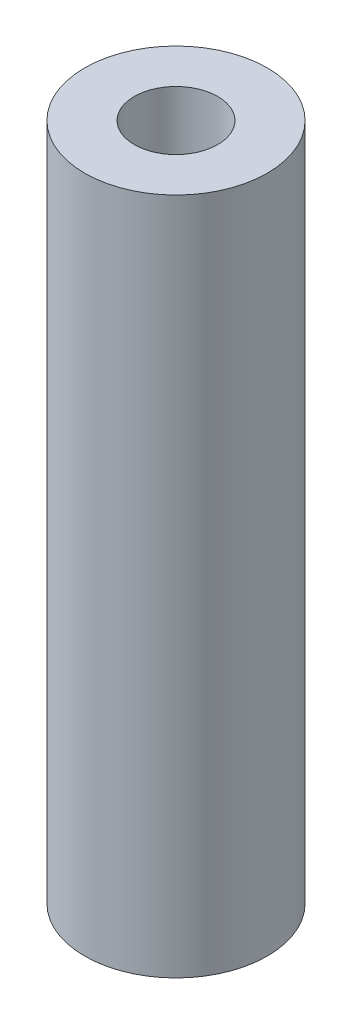
ISO-10303-21;
HEADER;
FILE_DESCRIPTION(('STEP AP214'),'2;1');
FILE_NAME('part.step','',(''),(''),'','','');
FILE_SCHEMA(('AUTOMOTIVE_DESIGN { 1 0 10303 214 1 1 1 1 }'));
ENDSEC;
DATA;
#1=APPLICATION_CONTEXT('core data for automotive mechanical design processes');
#2=APPLICATION_PROTOCOL_DEFINITION('international standard','automotive_design',2000,#1);
#3=PRODUCT_CONTEXT('',#1,'mechanical');
#4=PRODUCT('Part','Part','',(#3));
#5=PRODUCT_RELATED_PRODUCT_CATEGORY('part','',(#4));
#6=PRODUCT_DEFINITION_FORMATION('','',#4);
#7=PRODUCT_DEFINITION_CONTEXT('part definition',#1,'design');
#8=PRODUCT_DEFINITION('design','',#6,#7);
#9=PRODUCT_DEFINITION_SHAPE('','',#8);
#10=(LENGTH_UNIT() NAMED_UNIT(*) SI_UNIT(.MILLI.,.METRE.));
#11=(NAMED_UNIT(*) PLANE_ANGLE_UNIT() SI_UNIT($,.RADIAN.));
#12=(NAMED_UNIT(*) SI_UNIT($,.STERADIAN.) SOLID_ANGLE_UNIT());
#13=UNCERTAINTY_MEASURE_WITH_UNIT(LENGTH_MEASURE(1.E-05),#10,'distance_accuracy_value','');
#14=(GEOMETRIC_REPRESENTATION_CONTEXT(3) GLOBAL_UNCERTAINTY_ASSIGNED_CONTEXT((#13)) GLOBAL_UNIT_ASSIGNED_CONTEXT((#10,
#11,#12)) REPRESENTATION_CONTEXT('',''));
#15=CARTESIAN_POINT('',(0.,0.,0.));
#16=DIRECTION('',(0.,0.,1.));
#17=DIRECTION('',(1.,0.,0.));
#18=AXIS2_PLACEMENT_3D('',#15,#16,#17);
#19=CARTESIAN_POINT('',(0.,26.,0.));
#20=DIRECTION('',(0.,1.,0.));
#21=DIRECTION('',(0.,0.,1.));
#22=AXIS2_PLACEMENT_3D('',#19,#20,#21);
#23=PLANE('',#22);
#24=CARTESIAN_POINT('',(0.,26.,0.));
#25=DIRECTION('',(0.,1.,0.));
#26=DIRECTION('',(0.,0.,1.));
#27=AXIS2_PLACEMENT_3D('',#24,#25,#26);
#28=CIRCLE('',#27,3.5);
#29=CARTESIAN_POINT('',(0.,26.,-3.5));
#30=VERTEX_POINT('',#29);
#31=EDGE_CURVE('E10',#30,#30,#28,.T.);
#32=ORIENTED_EDGE('',*,*,#31,.T.);
#33=EDGE_LOOP('',(#32));
#34=FACE_BOUND('',#33,.T.);
#35=CARTESIAN_POINT('',(0.,26.,0.));
#36=DIRECTION('',(0.,1.,0.));
#37=DIRECTION('',(0.,0.,1.));
#38=AXIS2_PLACEMENT_3D('',#35,#36,#37);
#39=CIRCLE('',#38,1.6);
#40=CARTESIAN_POINT('',(0.,26.,-1.6));
#41=VERTEX_POINT('',#40);
#42=EDGE_CURVE('E46',#41,#41,#39,.T.);
#43=ORIENTED_EDGE('',*,*,#42,.F.);
#44=EDGE_LOOP('',(#43));
#45=FACE_BOUND('',#44,.T.);
#46=ADVANCED_FACE('F35',(#34,#45),#23,.T.);
#47=CARTESIAN_POINT('',(0.,0.,0.));
#48=DIRECTION('',(0.,1.,0.));
#49=DIRECTION('',(0.,0.,1.));
#50=AXIS2_PLACEMENT_3D('',#47,#48,#49);
#51=PLANE('',#50);
#52=CARTESIAN_POINT('',(0.,0.,0.));
#53=DIRECTION('',(0.,1.,0.));
#54=DIRECTION('',(0.,0.,1.));
#55=AXIS2_PLACEMENT_3D('',#52,#53,#54);
#56=CIRCLE('',#55,3.5);
#57=CARTESIAN_POINT('',(0.,0.,-3.5));
#58=VERTEX_POINT('',#57);
#59=EDGE_CURVE('E39',#58,#58,#56,.T.);
#60=ORIENTED_EDGE('',*,*,#59,.F.);
#61=EDGE_LOOP('',(#60));
#62=FACE_BOUND('',#61,.T.);
#63=CARTESIAN_POINT('',(0.,0.,0.));
#64=DIRECTION('',(0.,1.,0.));
#65=DIRECTION('',(0.,0.,1.));
#66=AXIS2_PLACEMENT_3D('',#63,#64,#65);
#67=CIRCLE('',#66,1.6);
#68=CARTESIAN_POINT('',(0.,0.,-1.6));
#69=VERTEX_POINT('',#68);
#70=EDGE_CURVE('E48',#69,#69,#67,.T.);
#71=ORIENTED_EDGE('',*,*,#70,.T.);
#72=EDGE_LOOP('',(#71));
#73=FACE_BOUND('',#72,.T.);
#74=ADVANCED_FACE('F58',(#62,#73),#51,.F.);
#75=CARTESIAN_POINT('',(0.,26.,0.));
#76=DIRECTION('',(0.,-1.,0.));
#77=DIRECTION('',(0.,0.,-1.));
#78=AXIS2_PLACEMENT_3D('',#75,#76,#77);
#79=CYLINDRICAL_SURFACE('',#78,3.5);
#80=CARTESIAN_POINT('',(0.,26.,-3.5));
#81=CARTESIAN_POINT('',(0.,25.7291666666667,-3.5));
#82=CARTESIAN_POINT('',(0.,25.4583333333333,-3.5));
#83=CARTESIAN_POINT('',(0.,24.9166666666667,-3.5));
#84=CARTESIAN_POINT('',(0.,24.6458333333333,-3.5));
#85=CARTESIAN_POINT('',(0.,24.1041666666667,-3.5));
#86=CARTESIAN_POINT('',(0.,23.8333333333333,-3.5));
#87=CARTESIAN_POINT('',(0.,23.2916666666667,-3.5));
#88=CARTESIAN_POINT('',(0.,23.0208333333333,-3.5));
#89=CARTESIAN_POINT('',(0.,22.4791666666667,-3.5));
#90=CARTESIAN_POINT('',(0.,22.2083333333333,-3.5));
#91=CARTESIAN_POINT('',(0.,21.6666666666667,-3.5));
#92=CARTESIAN_POINT('',(0.,21.3958333333333,-3.5));
#93=CARTESIAN_POINT('',(0.,20.8541666666667,-3.5));
#94=CARTESIAN_POINT('',(0.,20.5833333333333,-3.5));
#95=CARTESIAN_POINT('',(0.,20.0416666666667,-3.5));
#96=CARTESIAN_POINT('',(0.,19.7708333333333,-3.5));
#97=CARTESIAN_POINT('',(0.,19.2291666666667,-3.5));
#98=CARTESIAN_POINT('',(0.,18.9583333333333,-3.5));
#99=CARTESIAN_POINT('',(0.,18.4166666666667,-3.5));
#100=CARTESIAN_POINT('',(0.,18.1458333333333,-3.5));
#101=CARTESIAN_POINT('',(0.,17.6041666666667,-3.5));
#102=CARTESIAN_POINT('',(0.,17.3333333333333,-3.5));
#103=CARTESIAN_POINT('',(0.,16.7916666666667,-3.5));
#104=CARTESIAN_POINT('',(0.,16.5208333333333,-3.5));
#105=CARTESIAN_POINT('',(0.,15.9791666666667,-3.5));
#106=CARTESIAN_POINT('',(0.,15.7083333333333,-3.5));
#107=CARTESIAN_POINT('',(0.,15.1666666666667,-3.5));
#108=CARTESIAN_POINT('',(0.,14.8958333333333,-3.5));
#109=CARTESIAN_POINT('',(0.,14.3541666666667,-3.5));
#110=CARTESIAN_POINT('',(0.,14.0833333333333,-3.5));
#111=CARTESIAN_POINT('',(0.,13.5416666666667,-3.5));
#112=CARTESIAN_POINT('',(0.,13.2708333333333,-3.5));
#113=CARTESIAN_POINT('',(0.,12.7291666666667,-3.5));
#114=CARTESIAN_POINT('',(0.,12.4583333333333,-3.5));
#115=CARTESIAN_POINT('',(0.,11.9166666666667,-3.5));
#116=CARTESIAN_POINT('',(0.,11.6458333333333,-3.5));
#117=CARTESIAN_POINT('',(0.,11.1041666666667,-3.5));
#118=CARTESIAN_POINT('',(0.,10.8333333333333,-3.5));
#119=CARTESIAN_POINT('',(0.,10.2916666666667,-3.5));
#120=CARTESIAN_POINT('',(0.,10.0208333333333,-3.5));
#121=CARTESIAN_POINT('',(0.,9.47916666666667,-3.5));
#122=CARTESIAN_POINT('',(0.,9.20833333333333,-3.5));
#123=CARTESIAN_POINT('',(0.,8.66666666666667,-3.5));
#124=CARTESIAN_POINT('',(0.,8.39583333333333,-3.5));
#125=CARTESIAN_POINT('',(0.,7.85416666666667,-3.5));
#126=CARTESIAN_POINT('',(0.,7.58333333333333,-3.5));
#127=CARTESIAN_POINT('',(0.,7.04166666666667,-3.5));
#128=CARTESIAN_POINT('',(0.,6.77083333333333,-3.5));
#129=CARTESIAN_POINT('',(0.,6.22916666666667,-3.5));
#130=CARTESIAN_POINT('',(0.,5.95833333333333,-3.5));
#131=CARTESIAN_POINT('',(0.,5.41666666666667,-3.5));
#132=CARTESIAN_POINT('',(0.,5.14583333333333,-3.5));
#133=CARTESIAN_POINT('',(0.,4.60416666666667,-3.5));
#134=CARTESIAN_POINT('',(0.,4.33333333333333,-3.5));
#135=CARTESIAN_POINT('',(0.,3.79166666666667,-3.5));
#136=CARTESIAN_POINT('',(0.,3.52083333333333,-3.5));
#137=CARTESIAN_POINT('',(0.,2.97916666666667,-3.5));
#138=CARTESIAN_POINT('',(0.,2.70833333333333,-3.5));
#139=CARTESIAN_POINT('',(0.,2.16666666666667,-3.5));
#140=CARTESIAN_POINT('',(0.,1.89583333333333,-3.5));
#141=CARTESIAN_POINT('',(0.,1.35416666666667,-3.5));
#142=CARTESIAN_POINT('',(0.,1.08333333333333,-3.5));
#143=CARTESIAN_POINT('',(0.,0.541666666666667,-3.5));
#144=CARTESIAN_POINT('',(0.,0.270833333333334,-3.5));
#145=CARTESIAN_POINT('',(0.,0.,-3.5));
#146=B_SPLINE_CURVE_WITH_KNOTS('',3,(#80,#81,#82,#83,#84,#85,#86,#87,#88,#89,#90,#91,#92,#93,
#94,#95,#96,#97,#98,#99,#100,#101,#102,#103,#104,#105,#106,#107,#108,#109,#110,#111,#112,#113,
#114,#115,#116,#117,#118,#119,#120,#121,#122,#123,#124,#125,#126,#127,#128,#129,#130,#131,#132,
#133,#134,#135,#136,#137,#138,#139,#140,#141,#142,#143,#144,#145),.UNSPECIFIED.,.F.,.F.,(4,2,2,
2,2,2,2,2,2,2,2,2,2,2,2,2,2,2,2,2,2,2,2,2,2,2,2,2,2,2,2,2,4),(0.,0.812499999999997,1.625,2.4375,
3.25,4.0625,4.875,5.6875,6.5,7.3125,8.125,8.93749999999999,9.74999999999999,10.5625,11.375,
12.1875,13.,13.8125,14.625,15.4375,16.25,17.0625,17.875,18.6875,19.5,20.3125,21.125,21.9375,
22.75,23.5625,24.375,25.1875,26.),.UNSPECIFIED.);
#147=EDGE_CURVE('BSEAM37',#30,#58,#146,.T.);
#148=ORIENTED_EDGE('',*,*,#31,.F.);
#149=ORIENTED_EDGE('',*,*,#59,.T.);
#150=ORIENTED_EDGE('',*,*,#147,.T.);
#151=ORIENTED_EDGE('',*,*,#147,.F.);
#152=EDGE_LOOP('',(#148,#150,#149,#151));
#153=FACE_BOUND('',#152,.T.);
#154=ADVANCED_FACE('F37',(#153),#79,.T.);
#155=CARTESIAN_POINT('',(0.,26.,0.));
#156=DIRECTION('',(0.,-1.,0.));
#157=DIRECTION('',(0.,0.,-1.));
#158=AXIS2_PLACEMENT_3D('',#155,#156,#157);
#159=CYLINDRICAL_SURFACE('',#158,1.6);
#160=CARTESIAN_POINT('',(0.,26.,-1.6));
#161=CARTESIAN_POINT('',(0.,25.7291666666667,-1.6));
#162=CARTESIAN_POINT('',(0.,25.4583333333333,-1.6));
#163=CARTESIAN_POINT('',(0.,24.9166666666667,-1.6));
#164=CARTESIAN_POINT('',(0.,24.6458333333333,-1.6));
#165=CARTESIAN_POINT('',(0.,24.1041666666667,-1.6));
#166=CARTESIAN_POINT('',(0.,23.8333333333333,-1.6));
#167=CARTESIAN_POINT('',(0.,23.2916666666667,-1.6));
#168=CARTESIAN_POINT('',(0.,23.0208333333333,-1.6));
#169=CARTESIAN_POINT('',(0.,22.4791666666667,-1.6));
#170=CARTESIAN_POINT('',(0.,22.2083333333333,-1.6));
#171=CARTESIAN_POINT('',(0.,21.6666666666667,-1.6));
#172=CARTESIAN_POINT('',(0.,21.3958333333333,-1.6));
#173=CARTESIAN_POINT('',(0.,20.8541666666667,-1.6));
#174=CARTESIAN_POINT('',(0.,20.5833333333333,-1.6));
#175=CARTESIAN_POINT('',(0.,20.0416666666667,-1.6));
#176=CARTESIAN_POINT('',(0.,19.7708333333333,-1.6));
#177=CARTESIAN_POINT('',(0.,19.2291666666667,-1.6));
#178=CARTESIAN_POINT('',(0.,18.9583333333333,-1.6));
#179=CARTESIAN_POINT('',(0.,18.4166666666667,-1.6));
#180=CARTESIAN_POINT('',(0.,18.1458333333333,-1.6));
#181=CARTESIAN_POINT('',(0.,17.6041666666667,-1.6));
#182=CARTESIAN_POINT('',(0.,17.3333333333333,-1.6));
#183=CARTESIAN_POINT('',(0.,16.7916666666667,-1.6));
#184=CARTESIAN_POINT('',(0.,16.5208333333333,-1.6));
#185=CARTESIAN_POINT('',(0.,15.9791666666667,-1.6));
#186=CARTESIAN_POINT('',(0.,15.7083333333333,-1.6));
#187=CARTESIAN_POINT('',(0.,15.1666666666667,-1.6));
#188=CARTESIAN_POINT('',(0.,14.8958333333333,-1.6));
#189=CARTESIAN_POINT('',(0.,14.3541666666667,-1.6));
#190=CARTESIAN_POINT('',(0.,14.0833333333333,-1.6));
#191=CARTESIAN_POINT('',(0.,13.5416666666667,-1.6));
#192=CARTESIAN_POINT('',(0.,13.2708333333333,-1.6));
#193=CARTESIAN_POINT('',(0.,12.7291666666667,-1.6));
#194=CARTESIAN_POINT('',(0.,12.4583333333333,-1.6));
#195=CARTESIAN_POINT('',(0.,11.9166666666667,-1.6));
#196=CARTESIAN_POINT('',(0.,11.6458333333333,-1.6));
#197=CARTESIAN_POINT('',(0.,11.1041666666667,-1.6));
#198=CARTESIAN_POINT('',(0.,10.8333333333333,-1.6));
#199=CARTESIAN_POINT('',(0.,10.2916666666667,-1.6));
#200=CARTESIAN_POINT('',(0.,10.0208333333333,-1.6));
#201=CARTESIAN_POINT('',(0.,9.47916666666667,-1.6));
#202=CARTESIAN_POINT('',(0.,9.20833333333333,-1.6));
#203=CARTESIAN_POINT('',(0.,8.66666666666667,-1.6));
#204=CARTESIAN_POINT('',(0.,8.39583333333333,-1.6));
#205=CARTESIAN_POINT('',(0.,7.85416666666667,-1.6));
#206=CARTESIAN_POINT('',(0.,7.58333333333333,-1.6));
#207=CARTESIAN_POINT('',(0.,7.04166666666667,-1.6));
#208=CARTESIAN_POINT('',(0.,6.77083333333333,-1.6));
#209=CARTESIAN_POINT('',(0.,6.22916666666667,-1.6));
#210=CARTESIAN_POINT('',(0.,5.95833333333333,-1.6));
#211=CARTESIAN_POINT('',(0.,5.41666666666667,-1.6));
#212=CARTESIAN_POINT('',(0.,5.14583333333333,-1.6));
#213=CARTESIAN_POINT('',(0.,4.60416666666667,-1.6));
#214=CARTESIAN_POINT('',(0.,4.33333333333333,-1.6));
#215=CARTESIAN_POINT('',(0.,3.79166666666667,-1.6));
#216=CARTESIAN_POINT('',(0.,3.52083333333333,-1.6));
#217=CARTESIAN_POINT('',(0.,2.97916666666667,-1.6));
#218=CARTESIAN_POINT('',(0.,2.70833333333333,-1.6));
#219=CARTESIAN_POINT('',(0.,2.16666666666667,-1.6));
#220=CARTESIAN_POINT('',(0.,1.89583333333333,-1.6));
#221=CARTESIAN_POINT('',(0.,1.35416666666667,-1.6));
#222=CARTESIAN_POINT('',(0.,1.08333333333333,-1.6));
#223=CARTESIAN_POINT('',(0.,0.541666666666667,-1.6));
#224=CARTESIAN_POINT('',(0.,0.270833333333334,-1.6));
#225=CARTESIAN_POINT('',(0.,0.,-1.6));
#226=B_SPLINE_CURVE_WITH_KNOTS('',3,(#160,#161,#162,#163,#164,#165,#166,#167,#168,#169,#170,
#171,#172,#173,#174,#175,#176,#177,#178,#179,#180,#181,#182,#183,#184,#185,#186,#187,#188,#189,
#190,#191,#192,#193,#194,#195,#196,#197,#198,#199,#200,#201,#202,#203,#204,#205,#206,#207,#208,
#209,#210,#211,#212,#213,#214,#215,#216,#217,#218,#219,#220,#221,#222,#223,#224,#225),
.UNSPECIFIED.,.F.,.F.,(4,2,2,2,2,2,2,2,2,2,2,2,2,2,2,2,2,2,2,2,2,2,2,2,2,2,2,2,2,2,2,2,4),(0.,
0.812500000000001,1.625,2.4375,3.25,4.0625,4.875,5.6875,6.5,7.3125,8.125,8.9375,9.75,10.5625,
11.375,12.1875,13.,13.8125,14.625,15.4375,16.25,17.0625,17.875,18.6875,19.5,20.3125,21.125,
21.9375,22.75,23.5625,24.375,25.1875,26.),.UNSPECIFIED.);
#227=EDGE_CURVE('BSEAM54',#41,#69,#226,.T.);
#228=ORIENTED_EDGE('',*,*,#42,.T.);
#229=ORIENTED_EDGE('',*,*,#70,.F.);
#230=ORIENTED_EDGE('',*,*,#227,.T.);
#231=ORIENTED_EDGE('',*,*,#227,.F.);
#232=EDGE_LOOP('',(#228,#230,#229,#231));
#233=FACE_BOUND('',#232,.T.);
#234=ADVANCED_FACE('F54',(#233),#159,.F.);
#235=CLOSED_SHELL('',(#46,#74,#154,#234));
#236=MANIFOLD_SOLID_BREP('B2',#235);
#237=ADVANCED_BREP_SHAPE_REPRESENTATION('',(#18,#236),#14);
#238=SHAPE_DEFINITION_REPRESENTATION(#9,#237);
ENDSEC;
END-ISO-10303-21;
